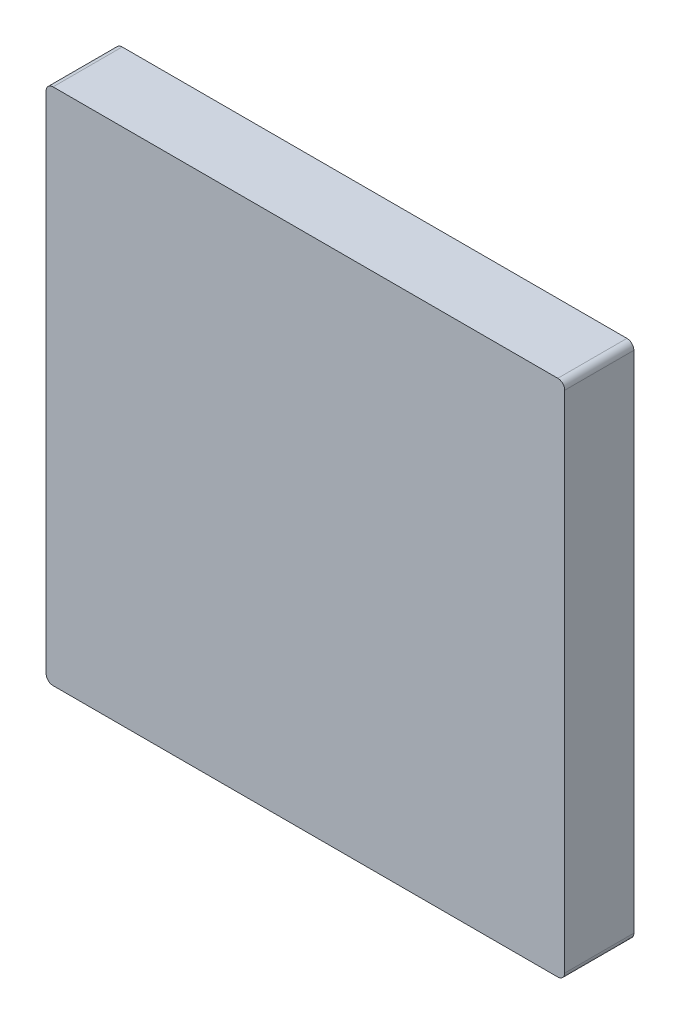
ISO-10303-21;
HEADER;
FILE_DESCRIPTION(('STEP AP214'),'2;1');
FILE_NAME('part.step','',(''),(''),'','','');
FILE_SCHEMA(('AUTOMOTIVE_DESIGN { 1 0 10303 214 1 1 1 1 }'));
ENDSEC;
DATA;
#1=APPLICATION_CONTEXT('core data for automotive mechanical design processes');
#2=APPLICATION_PROTOCOL_DEFINITION('international standard','automotive_design',2000,#1);
#3=PRODUCT_CONTEXT('',#1,'mechanical');
#4=PRODUCT('Part','Part','',(#3));
#5=PRODUCT_RELATED_PRODUCT_CATEGORY('part','',(#4));
#6=PRODUCT_DEFINITION_FORMATION('','',#4);
#7=PRODUCT_DEFINITION_CONTEXT('part definition',#1,'design');
#8=PRODUCT_DEFINITION('design','',#6,#7);
#9=PRODUCT_DEFINITION_SHAPE('','',#8);
#10=(LENGTH_UNIT() NAMED_UNIT(*) SI_UNIT(.MILLI.,.METRE.));
#11=(NAMED_UNIT(*) PLANE_ANGLE_UNIT() SI_UNIT($,.RADIAN.));
#12=(NAMED_UNIT(*) SI_UNIT($,.STERADIAN.) SOLID_ANGLE_UNIT());
#13=UNCERTAINTY_MEASURE_WITH_UNIT(LENGTH_MEASURE(1.E-05),#10,'distance_accuracy_value','');
#14=(GEOMETRIC_REPRESENTATION_CONTEXT(3) GLOBAL_UNCERTAINTY_ASSIGNED_CONTEXT((#13)) GLOBAL_UNIT_ASSIGNED_CONTEXT((#10,
#11,#12)) REPRESENTATION_CONTEXT('',''));
#15=CARTESIAN_POINT('',(0.,0.,0.));
#16=DIRECTION('',(0.,0.,1.));
#17=DIRECTION('',(1.,0.,0.));
#18=AXIS2_PLACEMENT_3D('',#15,#16,#17);
#19=CARTESIAN_POINT('',(75.,-75.,20.));
#20=DIRECTION('',(-1.,0.,0.));
#21=DIRECTION('',(0.,0.,1.));
#22=AXIS2_PLACEMENT_3D('',#19,#20,#21);
#23=PLANE('',#22);
#24=DIRECTION('',(0.,1.,0.));
#25=VECTOR('',#24,1.);
#26=CARTESIAN_POINT('',(75.,-75.,20.));
#27=LINE('',#26,#25);
#28=CARTESIAN_POINT('',(75.,-73.,20.));
#29=VERTEX_POINT('',#28);
#30=CARTESIAN_POINT('',(75.,73.,20.));
#31=VERTEX_POINT('',#30);
#32=EDGE_CURVE('E126',#29,#31,#27,.T.);
#33=ORIENTED_EDGE('',*,*,#32,.F.);
#34=DIRECTION('',(0.,0.,-1.));
#35=VECTOR('',#34,1.);
#36=CARTESIAN_POINT('',(75.,-73.,20.));
#37=LINE('',#36,#35);
#38=CARTESIAN_POINT('',(75.,-73.,0.));
#39=VERTEX_POINT('',#38);
#40=EDGE_CURVE('E152',#29,#39,#37,.T.);
#41=ORIENTED_EDGE('',*,*,#40,.T.);
#42=DIRECTION('',(0.,1.,0.));
#43=VECTOR('',#42,1.);
#44=CARTESIAN_POINT('',(75.,-75.,0.));
#45=LINE('',#44,#43);
#46=CARTESIAN_POINT('',(75.,73.,0.));
#47=VERTEX_POINT('',#46);
#48=EDGE_CURVE('E160',#39,#47,#45,.T.);
#49=ORIENTED_EDGE('',*,*,#48,.T.);
#50=DIRECTION('',(0.,0.,-1.));
#51=VECTOR('',#50,1.);
#52=CARTESIAN_POINT('',(75.,73.,20.));
#53=LINE('',#52,#51);
#54=EDGE_CURVE('E150',#47,#31,#53,.F.);
#55=ORIENTED_EDGE('',*,*,#54,.T.);
#56=EDGE_LOOP('',(#33,#41,#49,#55));
#57=FACE_BOUND('',#56,.T.);
#58=ADVANCED_FACE('F35',(#57),#23,.F.);
#59=CARTESIAN_POINT('',(-75.,75.,20.));
#60=DIRECTION('',(0.,-1.,0.));
#61=DIRECTION('',(0.,0.,-1.));
#62=AXIS2_PLACEMENT_3D('',#59,#60,#61);
#63=PLANE('',#62);
#64=DIRECTION('',(-1.,0.,0.));
#65=VECTOR('',#64,1.);
#66=CARTESIAN_POINT('',(-75.,75.,0.));
#67=LINE('',#66,#65);
#68=CARTESIAN_POINT('',(73.,75.,0.));
#69=VERTEX_POINT('',#68);
#70=CARTESIAN_POINT('',(-73.,75.,0.));
#71=VERTEX_POINT('',#70);
#72=EDGE_CURVE('E131',#69,#71,#67,.T.);
#73=ORIENTED_EDGE('',*,*,#72,.T.);
#74=DIRECTION('',(0.,0.,-1.));
#75=VECTOR('',#74,1.);
#76=CARTESIAN_POINT('',(-73.,75.,20.));
#77=LINE('',#76,#75);
#78=CARTESIAN_POINT('',(-73.,75.,20.));
#79=VERTEX_POINT('',#78);
#80=EDGE_CURVE('E11',#71,#79,#77,.F.);
#81=ORIENTED_EDGE('',*,*,#80,.T.);
#82=DIRECTION('',(-1.,0.,0.));
#83=VECTOR('',#82,1.);
#84=CARTESIAN_POINT('',(-75.,75.,20.));
#85=LINE('',#84,#83);
#86=CARTESIAN_POINT('',(73.,75.,20.));
#87=VERTEX_POINT('',#86);
#88=EDGE_CURVE('E129',#87,#79,#85,.T.);
#89=ORIENTED_EDGE('',*,*,#88,.F.);
#90=DIRECTION('',(0.,0.,-1.));
#91=VECTOR('',#90,1.);
#92=CARTESIAN_POINT('',(73.,75.,20.));
#93=LINE('',#92,#91);
#94=EDGE_CURVE('E43',#87,#69,#93,.T.);
#95=ORIENTED_EDGE('',*,*,#94,.T.);
#96=EDGE_LOOP('',(#73,#81,#89,#95));
#97=FACE_BOUND('',#96,.T.);
#98=ADVANCED_FACE('F157',(#97),#63,.F.);
#99=CARTESIAN_POINT('',(-75.,-75.,20.));
#100=DIRECTION('',(1.,0.,0.));
#101=DIRECTION('',(0.,0.,-1.));
#102=AXIS2_PLACEMENT_3D('',#99,#100,#101);
#103=PLANE('',#102);
#104=DIRECTION('',(0.,-1.,0.));
#105=VECTOR('',#104,1.);
#106=CARTESIAN_POINT('',(-75.,-75.,0.));
#107=LINE('',#106,#105);
#108=CARTESIAN_POINT('',(-75.,73.,0.));
#109=VERTEX_POINT('',#108);
#110=CARTESIAN_POINT('',(-75.,-73.,0.));
#111=VERTEX_POINT('',#110);
#112=EDGE_CURVE('E127',#109,#111,#107,.T.);
#113=ORIENTED_EDGE('',*,*,#112,.T.);
#114=DIRECTION('',(0.,0.,-1.));
#115=VECTOR('',#114,1.);
#116=CARTESIAN_POINT('',(-75.,-73.,20.));
#117=LINE('',#116,#115);
#118=CARTESIAN_POINT('',(-75.,-73.,20.));
#119=VERTEX_POINT('',#118);
#120=EDGE_CURVE('E105',#111,#119,#117,.F.);
#121=ORIENTED_EDGE('',*,*,#120,.T.);
#122=DIRECTION('',(0.,-1.,0.));
#123=VECTOR('',#122,1.);
#124=CARTESIAN_POINT('',(-75.,-75.,20.));
#125=LINE('',#124,#123);
#126=CARTESIAN_POINT('',(-75.,73.,20.));
#127=VERTEX_POINT('',#126);
#128=EDGE_CURVE('E164',#127,#119,#125,.T.);
#129=ORIENTED_EDGE('',*,*,#128,.F.);
#130=DIRECTION('',(0.,0.,-1.));
#131=VECTOR('',#130,1.);
#132=CARTESIAN_POINT('',(-75.,73.,20.));
#133=LINE('',#132,#131);
#134=EDGE_CURVE('E110',#127,#109,#133,.T.);
#135=ORIENTED_EDGE('',*,*,#134,.T.);
#136=EDGE_LOOP('',(#113,#121,#129,#135));
#137=FACE_BOUND('',#136,.T.);
#138=ADVANCED_FACE('F174',(#137),#103,.F.);
#139=CARTESIAN_POINT('',(-75.,-75.,20.));
#140=DIRECTION('',(0.,1.,0.));
#141=DIRECTION('',(0.,0.,1.));
#142=AXIS2_PLACEMENT_3D('',#139,#140,#141);
#143=PLANE('',#142);
#144=DIRECTION('',(1.,0.,0.));
#145=VECTOR('',#144,1.);
#146=CARTESIAN_POINT('',(-75.,-75.,20.));
#147=LINE('',#146,#145);
#148=CARTESIAN_POINT('',(-73.,-75.,20.));
#149=VERTEX_POINT('',#148);
#150=CARTESIAN_POINT('',(73.,-75.,20.));
#151=VERTEX_POINT('',#150);
#152=EDGE_CURVE('E120',#149,#151,#147,.T.);
#153=ORIENTED_EDGE('',*,*,#152,.F.);
#154=DIRECTION('',(0.,0.,-1.));
#155=VECTOR('',#154,1.);
#156=CARTESIAN_POINT('',(-73.,-75.,20.));
#157=LINE('',#156,#155);
#158=CARTESIAN_POINT('',(-73.,-75.,0.));
#159=VERTEX_POINT('',#158);
#160=EDGE_CURVE('E104',#149,#159,#157,.T.);
#161=ORIENTED_EDGE('',*,*,#160,.T.);
#162=DIRECTION('',(1.,0.,0.));
#163=VECTOR('',#162,1.);
#164=CARTESIAN_POINT('',(-75.,-75.,0.));
#165=LINE('',#164,#163);
#166=CARTESIAN_POINT('',(73.,-75.,0.));
#167=VERTEX_POINT('',#166);
#168=EDGE_CURVE('E117',#159,#167,#165,.T.);
#169=ORIENTED_EDGE('',*,*,#168,.T.);
#170=DIRECTION('',(0.,0.,-1.));
#171=VECTOR('',#170,1.);
#172=CARTESIAN_POINT('',(73.,-75.,20.));
#173=LINE('',#172,#171);
#174=EDGE_CURVE('E122',#167,#151,#173,.F.);
#175=ORIENTED_EDGE('',*,*,#174,.T.);
#176=EDGE_LOOP('',(#153,#161,#169,#175));
#177=FACE_BOUND('',#176,.T.);
#178=ADVANCED_FACE('F116',(#177),#143,.F.);
#179=CARTESIAN_POINT('',(0.,0.,20.));
#180=DIRECTION('',(0.,0.,-1.));
#181=DIRECTION('',(-1.,0.,0.));
#182=AXIS2_PLACEMENT_3D('',#179,#180,#181);
#183=PLANE('',#182);
#184=ORIENTED_EDGE('',*,*,#128,.T.);
#185=CARTESIAN_POINT('',(-73.,-73.,20.));
#186=DIRECTION('',(0.,0.,-1.));
#187=DIRECTION('',(-1.,0.,0.));
#188=AXIS2_PLACEMENT_3D('',#185,#186,#187);
#189=CIRCLE('',#188,2.);
#190=EDGE_CURVE('E148',#119,#149,#189,.F.);
#191=ORIENTED_EDGE('',*,*,#190,.T.);
#192=ORIENTED_EDGE('',*,*,#152,.T.);
#193=CARTESIAN_POINT('',(73.,-73.,20.));
#194=DIRECTION('',(0.,0.,-1.));
#195=DIRECTION('',(-1.,0.,0.));
#196=AXIS2_PLACEMENT_3D('',#193,#194,#195);
#197=CIRCLE('',#196,2.);
#198=EDGE_CURVE('E146',#151,#29,#197,.F.);
#199=ORIENTED_EDGE('',*,*,#198,.T.);
#200=ORIENTED_EDGE('',*,*,#32,.T.);
#201=CARTESIAN_POINT('',(73.,73.,20.));
#202=DIRECTION('',(0.,0.,-1.));
#203=DIRECTION('',(-1.,0.,0.));
#204=AXIS2_PLACEMENT_3D('',#201,#202,#203);
#205=CIRCLE('',#204,2.);
#206=EDGE_CURVE('E55',#31,#87,#205,.F.);
#207=ORIENTED_EDGE('',*,*,#206,.T.);
#208=ORIENTED_EDGE('',*,*,#88,.T.);
#209=CARTESIAN_POINT('',(-73.,73.,20.));
#210=DIRECTION('',(0.,0.,-1.));
#211=DIRECTION('',(-1.,0.,0.));
#212=AXIS2_PLACEMENT_3D('',#209,#210,#211);
#213=CIRCLE('',#212,2.);
#214=EDGE_CURVE('E144',#79,#127,#213,.F.);
#215=ORIENTED_EDGE('',*,*,#214,.T.);
#216=EDGE_LOOP('',(#184,#191,#192,#199,#200,#207,#208,#215));
#217=FACE_BOUND('',#216,.T.);
#218=ADVANCED_FACE('F168',(#217),#183,.F.);
#219=CARTESIAN_POINT('',(0.,0.,0.));
#220=DIRECTION('',(0.,0.,-1.));
#221=DIRECTION('',(-1.,0.,0.));
#222=AXIS2_PLACEMENT_3D('',#219,#220,#221);
#223=PLANE('',#222);
#224=ORIENTED_EDGE('',*,*,#168,.F.);
#225=CARTESIAN_POINT('',(-73.,-73.,0.));
#226=DIRECTION('',(0.,0.,-1.));
#227=DIRECTION('',(-1.,0.,0.));
#228=AXIS2_PLACEMENT_3D('',#225,#226,#227);
#229=CIRCLE('',#228,2.);
#230=EDGE_CURVE('E100',#159,#111,#229,.T.);
#231=ORIENTED_EDGE('',*,*,#230,.T.);
#232=ORIENTED_EDGE('',*,*,#112,.F.);
#233=CARTESIAN_POINT('',(-73.,73.,0.));
#234=DIRECTION('',(0.,0.,-1.));
#235=DIRECTION('',(-1.,0.,0.));
#236=AXIS2_PLACEMENT_3D('',#233,#234,#235);
#237=CIRCLE('',#236,2.);
#238=EDGE_CURVE('E137',#109,#71,#237,.T.);
#239=ORIENTED_EDGE('',*,*,#238,.T.);
#240=ORIENTED_EDGE('',*,*,#72,.F.);
#241=CARTESIAN_POINT('',(73.,73.,0.));
#242=DIRECTION('',(0.,0.,-1.));
#243=DIRECTION('',(-1.,0.,0.));
#244=AXIS2_PLACEMENT_3D('',#241,#242,#243);
#245=CIRCLE('',#244,2.);
#246=EDGE_CURVE('E121',#69,#47,#245,.T.);
#247=ORIENTED_EDGE('',*,*,#246,.T.);
#248=ORIENTED_EDGE('',*,*,#48,.F.);
#249=CARTESIAN_POINT('',(73.,-73.,0.));
#250=DIRECTION('',(0.,0.,-1.));
#251=DIRECTION('',(-1.,0.,0.));
#252=AXIS2_PLACEMENT_3D('',#249,#250,#251);
#253=CIRCLE('',#252,2.);
#254=EDGE_CURVE('E111',#39,#167,#253,.T.);
#255=ORIENTED_EDGE('',*,*,#254,.T.);
#256=EDGE_LOOP('',(#224,#231,#232,#239,#240,#247,#248,#255));
#257=FACE_BOUND('',#256,.T.);
#258=ADVANCED_FACE('F124',(#257),#223,.T.);
#259=CARTESIAN_POINT('',(-73.,-73.,20.));
#260=DIRECTION('',(0.,0.,-1.));
#261=DIRECTION('',(-1.,0.,0.));
#262=AXIS2_PLACEMENT_3D('',#259,#260,#261);
#263=CYLINDRICAL_SURFACE('',#262,2.);
#264=ORIENTED_EDGE('',*,*,#190,.F.);
#265=ORIENTED_EDGE('',*,*,#120,.F.);
#266=ORIENTED_EDGE('',*,*,#230,.F.);
#267=ORIENTED_EDGE('',*,*,#160,.F.);
#268=EDGE_LOOP('',(#264,#265,#266,#267));
#269=FACE_BOUND('',#268,.T.);
#270=ADVANCED_FACE('F103',(#269),#263,.T.);
#271=CARTESIAN_POINT('',(73.,-73.,20.));
#272=DIRECTION('',(0.,0.,-1.));
#273=DIRECTION('',(-1.,0.,0.));
#274=AXIS2_PLACEMENT_3D('',#271,#272,#273);
#275=CYLINDRICAL_SURFACE('',#274,2.);
#276=ORIENTED_EDGE('',*,*,#198,.F.);
#277=ORIENTED_EDGE('',*,*,#174,.F.);
#278=ORIENTED_EDGE('',*,*,#254,.F.);
#279=ORIENTED_EDGE('',*,*,#40,.F.);
#280=EDGE_LOOP('',(#276,#277,#278,#279));
#281=FACE_BOUND('',#280,.T.);
#282=ADVANCED_FACE('F179',(#281),#275,.T.);
#283=CARTESIAN_POINT('',(-73.,73.,20.));
#284=DIRECTION('',(0.,0.,-1.));
#285=DIRECTION('',(-1.,0.,0.));
#286=AXIS2_PLACEMENT_3D('',#283,#284,#285);
#287=CYLINDRICAL_SURFACE('',#286,2.);
#288=ORIENTED_EDGE('',*,*,#214,.F.);
#289=ORIENTED_EDGE('',*,*,#80,.F.);
#290=ORIENTED_EDGE('',*,*,#238,.F.);
#291=ORIENTED_EDGE('',*,*,#134,.F.);
#292=EDGE_LOOP('',(#288,#289,#290,#291));
#293=FACE_BOUND('',#292,.T.);
#294=ADVANCED_FACE('F172',(#293),#287,.T.);
#295=CARTESIAN_POINT('',(73.,73.,20.));
#296=DIRECTION('',(0.,0.,-1.));
#297=DIRECTION('',(-1.,0.,0.));
#298=AXIS2_PLACEMENT_3D('',#295,#296,#297);
#299=CYLINDRICAL_SURFACE('',#298,2.);
#300=ORIENTED_EDGE('',*,*,#206,.F.);
#301=ORIENTED_EDGE('',*,*,#54,.F.);
#302=ORIENTED_EDGE('',*,*,#246,.F.);
#303=ORIENTED_EDGE('',*,*,#94,.F.);
#304=EDGE_LOOP('',(#300,#301,#302,#303));
#305=FACE_BOUND('',#304,.T.);
#306=ADVANCED_FACE('F37',(#305),#299,.T.);
#307=CLOSED_SHELL('',(#58,#98,#138,#178,#218,#258,#270,#282,#294,#306));
#308=MANIFOLD_SOLID_BREP('B2',#307);
#309=ADVANCED_BREP_SHAPE_REPRESENTATION('',(#18,#308),#14);
#310=SHAPE_DEFINITION_REPRESENTATION(#9,#309);
ENDSEC;
END-ISO-10303-21;
